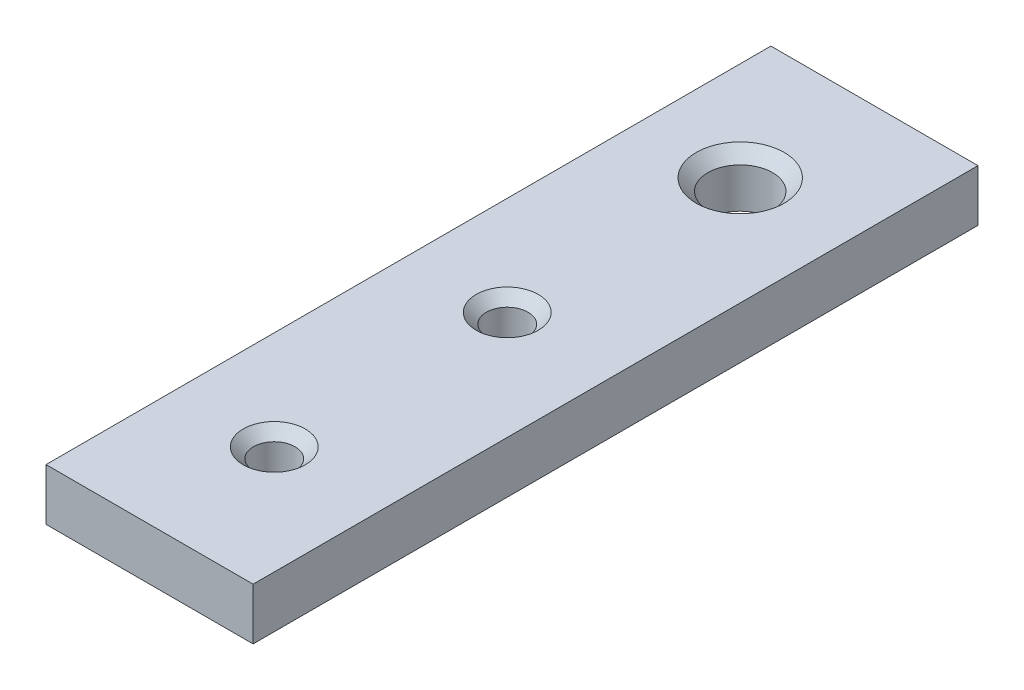
ISO-10303-21;
HEADER;
FILE_DESCRIPTION(('STEP AP214'),'2;1');
FILE_NAME('part.step','',(''),(''),'','','');
FILE_SCHEMA(('AUTOMOTIVE_DESIGN { 1 0 10303 214 1 1 1 1 }'));
ENDSEC;
DATA;
#1=APPLICATION_CONTEXT('core data for automotive mechanical design processes');
#2=APPLICATION_PROTOCOL_DEFINITION('international standard','automotive_design',2000,#1);
#3=PRODUCT_CONTEXT('',#1,'mechanical');
#4=PRODUCT('Part','Part','',(#3));
#5=PRODUCT_RELATED_PRODUCT_CATEGORY('part','',(#4));
#6=PRODUCT_DEFINITION_FORMATION('','',#4);
#7=PRODUCT_DEFINITION_CONTEXT('part definition',#1,'design');
#8=PRODUCT_DEFINITION('design','',#6,#7);
#9=PRODUCT_DEFINITION_SHAPE('','',#8);
#10=(LENGTH_UNIT() NAMED_UNIT(*) SI_UNIT(.MILLI.,.METRE.));
#11=(NAMED_UNIT(*) PLANE_ANGLE_UNIT() SI_UNIT($,.RADIAN.));
#12=(NAMED_UNIT(*) SI_UNIT($,.STERADIAN.) SOLID_ANGLE_UNIT());
#13=UNCERTAINTY_MEASURE_WITH_UNIT(LENGTH_MEASURE(1.E-05),#10,'distance_accuracy_value','');
#14=(GEOMETRIC_REPRESENTATION_CONTEXT(3) GLOBAL_UNCERTAINTY_ASSIGNED_CONTEXT((#13)) GLOBAL_UNIT_ASSIGNED_CONTEXT((#10,
#11,#12)) REPRESENTATION_CONTEXT('',''));
#15=CARTESIAN_POINT('',(0.,0.,0.));
#16=DIRECTION('',(0.,0.,1.));
#17=DIRECTION('',(1.,0.,0.));
#18=AXIS2_PLACEMENT_3D('',#15,#16,#17);
#19=CARTESIAN_POINT('',(0.,6.35,0.));
#20=DIRECTION('',(-1.,0.,0.));
#21=DIRECTION('',(0.,0.,1.));
#22=AXIS2_PLACEMENT_3D('',#19,#20,#21);
#23=PLANE('',#22);
#24=DIRECTION('',(0.,0.,-1.));
#25=VECTOR('',#24,1.);
#26=CARTESIAN_POINT('',(0.,0.,0.));
#27=LINE('',#26,#25);
#28=CARTESIAN_POINT('',(0.,0.,0.));
#29=VERTEX_POINT('',#28);
#30=CARTESIAN_POINT('',(0.,0.,-88.9));
#31=VERTEX_POINT('',#30);
#32=EDGE_CURVE('E101',#29,#31,#27,.T.);
#33=ORIENTED_EDGE('',*,*,#32,.T.);
#34=DIRECTION('',(0.,-1.,0.));
#35=VECTOR('',#34,1.);
#36=CARTESIAN_POINT('',(0.,6.35,-88.9));
#37=LINE('',#36,#35);
#38=CARTESIAN_POINT('',(0.,6.35,-88.9));
#39=VERTEX_POINT('',#38);
#40=EDGE_CURVE('E11',#39,#31,#37,.T.);
#41=ORIENTED_EDGE('',*,*,#40,.F.);
#42=DIRECTION('',(0.,0.,-1.));
#43=VECTOR('',#42,1.);
#44=CARTESIAN_POINT('',(0.,6.35,0.));
#45=LINE('',#44,#43);
#46=CARTESIAN_POINT('',(0.,6.35,0.));
#47=VERTEX_POINT('',#46);
#48=EDGE_CURVE('E89',#47,#39,#45,.T.);
#49=ORIENTED_EDGE('',*,*,#48,.F.);
#50=DIRECTION('',(0.,-1.,0.));
#51=VECTOR('',#50,1.);
#52=CARTESIAN_POINT('',(0.,6.35,0.));
#53=LINE('',#52,#51);
#54=EDGE_CURVE('E97',#47,#29,#53,.T.);
#55=ORIENTED_EDGE('',*,*,#54,.T.);
#56=EDGE_LOOP('',(#33,#41,#49,#55));
#57=FACE_BOUND('',#56,.T.);
#58=ADVANCED_FACE('F38',(#57),#23,.F.);
#59=CARTESIAN_POINT('',(0.,6.35,-88.9));
#60=DIRECTION('',(0.,0.,1.));
#61=DIRECTION('',(1.,0.,0.));
#62=AXIS2_PLACEMENT_3D('',#59,#60,#61);
#63=PLANE('',#62);
#64=DIRECTION('',(-1.,0.,0.));
#65=VECTOR('',#64,1.);
#66=CARTESIAN_POINT('',(0.,0.,-88.9));
#67=LINE('',#66,#65);
#68=CARTESIAN_POINT('',(-25.4,0.,-88.9));
#69=VERTEX_POINT('',#68);
#70=EDGE_CURVE('E93',#31,#69,#67,.T.);
#71=ORIENTED_EDGE('',*,*,#70,.T.);
#72=DIRECTION('',(0.,-1.,0.));
#73=VECTOR('',#72,1.);
#74=CARTESIAN_POINT('',(-25.4,6.35,-88.9));
#75=LINE('',#74,#73);
#76=CARTESIAN_POINT('',(-25.4,6.35,-88.9));
#77=VERTEX_POINT('',#76);
#78=EDGE_CURVE('E46',#77,#69,#75,.T.);
#79=ORIENTED_EDGE('',*,*,#78,.F.);
#80=DIRECTION('',(-1.,0.,0.));
#81=VECTOR('',#80,1.);
#82=CARTESIAN_POINT('',(0.,6.35,-88.9));
#83=LINE('',#82,#81);
#84=EDGE_CURVE('E84',#39,#77,#83,.T.);
#85=ORIENTED_EDGE('',*,*,#84,.F.);
#86=ORIENTED_EDGE('',*,*,#40,.T.);
#87=EDGE_LOOP('',(#71,#79,#85,#86));
#88=FACE_BOUND('',#87,.T.);
#89=ADVANCED_FACE('F92',(#88),#63,.F.);
#90=CARTESIAN_POINT('',(-25.4,6.35,0.));
#91=DIRECTION('',(1.,0.,0.));
#92=DIRECTION('',(0.,0.,-1.));
#93=AXIS2_PLACEMENT_3D('',#90,#91,#92);
#94=PLANE('',#93);
#95=DIRECTION('',(0.,0.,1.));
#96=VECTOR('',#95,1.);
#97=CARTESIAN_POINT('',(-25.4,0.,0.));
#98=LINE('',#97,#96);
#99=CARTESIAN_POINT('',(-25.4,0.,0.));
#100=VERTEX_POINT('',#99);
#101=EDGE_CURVE('E71',#69,#100,#98,.T.);
#102=ORIENTED_EDGE('',*,*,#101,.T.);
#103=DIRECTION('',(0.,-1.,0.));
#104=VECTOR('',#103,1.);
#105=CARTESIAN_POINT('',(-25.4,6.35,0.));
#106=LINE('',#105,#104);
#107=CARTESIAN_POINT('',(-25.4,6.35,0.));
#108=VERTEX_POINT('',#107);
#109=EDGE_CURVE('E94',#108,#100,#106,.T.);
#110=ORIENTED_EDGE('',*,*,#109,.F.);
#111=DIRECTION('',(0.,0.,1.));
#112=VECTOR('',#111,1.);
#113=CARTESIAN_POINT('',(-25.4,6.35,0.));
#114=LINE('',#113,#112);
#115=EDGE_CURVE('E87',#77,#108,#114,.T.);
#116=ORIENTED_EDGE('',*,*,#115,.F.);
#117=ORIENTED_EDGE('',*,*,#78,.T.);
#118=EDGE_LOOP('',(#102,#110,#116,#117));
#119=FACE_BOUND('',#118,.T.);
#120=ADVANCED_FACE('F95',(#119),#94,.F.);
#121=CARTESIAN_POINT('',(0.,6.35,0.));
#122=DIRECTION('',(0.,0.,-1.));
#123=DIRECTION('',(-1.,0.,0.));
#124=AXIS2_PLACEMENT_3D('',#121,#122,#123);
#125=PLANE('',#124);
#126=DIRECTION('',(1.,0.,0.));
#127=VECTOR('',#126,1.);
#128=CARTESIAN_POINT('',(0.,0.,0.));
#129=LINE('',#128,#127);
#130=EDGE_CURVE('E77',#100,#29,#129,.T.);
#131=ORIENTED_EDGE('',*,*,#130,.T.);
#132=ORIENTED_EDGE('',*,*,#54,.F.);
#133=DIRECTION('',(1.,0.,0.));
#134=VECTOR('',#133,1.);
#135=CARTESIAN_POINT('',(0.,6.35,0.));
#136=LINE('',#135,#134);
#137=EDGE_CURVE('E54',#108,#47,#136,.T.);
#138=ORIENTED_EDGE('',*,*,#137,.F.);
#139=ORIENTED_EDGE('',*,*,#109,.T.);
#140=EDGE_LOOP('',(#131,#132,#138,#139));
#141=FACE_BOUND('',#140,.T.);
#142=ADVANCED_FACE('F109',(#141),#125,.F.);
#143=CARTESIAN_POINT('',(0.,6.35,0.));
#144=DIRECTION('',(0.,1.,0.));
#145=DIRECTION('',(0.,0.,1.));
#146=AXIS2_PLACEMENT_3D('',#143,#144,#145);
#147=PLANE('',#146);
#148=CARTESIAN_POINT('',(-13.2844190722783,6.35,-73.025));
#149=DIRECTION('',(0.,1.,0.));
#150=DIRECTION('',(0.,0.,1.));
#151=AXIS2_PLACEMENT_3D('',#148,#149,#150);
#152=CIRCLE('',#151,5.3975);
#153=CARTESIAN_POINT('',(-13.2844190722783,6.35,-67.6275));
#154=VERTEX_POINT('',#153);
#155=EDGE_CURVE('E138',#154,#154,#152,.T.);
#156=ORIENTED_EDGE('',*,*,#155,.F.);
#157=EDGE_LOOP('',(#156));
#158=FACE_BOUND('',#157,.T.);
#159=CARTESIAN_POINT('',(-13.2844190722783,6.35,-15.875));
#160=DIRECTION('',(0.,1.,0.));
#161=DIRECTION('',(0.,0.,1.));
#162=AXIS2_PLACEMENT_3D('',#159,#160,#161);
#163=CIRCLE('',#162,3.81);
#164=CARTESIAN_POINT('',(-13.2844190722783,6.35,-12.065));
#165=VERTEX_POINT('',#164);
#166=EDGE_CURVE('E129',#165,#165,#163,.T.);
#167=ORIENTED_EDGE('',*,*,#166,.F.);
#168=EDGE_LOOP('',(#167));
#169=FACE_BOUND('',#168,.T.);
#170=CARTESIAN_POINT('',(-13.2844190722783,6.35,-44.45));
#171=DIRECTION('',(0.,1.,0.));
#172=DIRECTION('',(0.,0.,1.));
#173=AXIS2_PLACEMENT_3D('',#170,#171,#172);
#174=CIRCLE('',#173,3.81);
#175=CARTESIAN_POINT('',(-13.2844190722783,6.35,-40.64));
#176=VERTEX_POINT('',#175);
#177=EDGE_CURVE('E120',#176,#176,#174,.T.);
#178=ORIENTED_EDGE('',*,*,#177,.F.);
#179=EDGE_LOOP('',(#178));
#180=FACE_BOUND('',#179,.T.);
#181=ORIENTED_EDGE('',*,*,#48,.T.);
#182=ORIENTED_EDGE('',*,*,#84,.T.);
#183=ORIENTED_EDGE('',*,*,#115,.T.);
#184=ORIENTED_EDGE('',*,*,#137,.T.);
#185=EDGE_LOOP('',(#181,#182,#183,#184));
#186=FACE_BOUND('',#185,.T.);
#187=ADVANCED_FACE('F85',(#158,#169,#180,#186),#147,.T.);
#188=CARTESIAN_POINT('',(0.,0.,0.));
#189=DIRECTION('',(0.,1.,0.));
#190=DIRECTION('',(0.,0.,1.));
#191=AXIS2_PLACEMENT_3D('',#188,#189,#190);
#192=PLANE('',#191);
#193=CARTESIAN_POINT('',(-13.2844190722783,0.,-73.025));
#194=DIRECTION('',(0.,1.,0.));
#195=DIRECTION('',(0.,0.,1.));
#196=AXIS2_PLACEMENT_3D('',#193,#194,#195);
#197=CIRCLE('',#196,3.96875);
#198=CARTESIAN_POINT('',(-13.2844190722783,0.,-69.05625));
#199=VERTEX_POINT('',#198);
#200=EDGE_CURVE('E132',#199,#199,#197,.T.);
#201=ORIENTED_EDGE('',*,*,#200,.T.);
#202=EDGE_LOOP('',(#201));
#203=FACE_BOUND('',#202,.T.);
#204=CARTESIAN_POINT('',(-13.2844190722783,0.,-15.875));
#205=DIRECTION('',(0.,1.,0.));
#206=DIRECTION('',(0.,0.,1.));
#207=AXIS2_PLACEMENT_3D('',#204,#205,#206);
#208=CIRCLE('',#207,2.5527);
#209=CARTESIAN_POINT('',(-13.2844190722783,0.,-13.3223));
#210=VERTEX_POINT('',#209);
#211=EDGE_CURVE('E123',#210,#210,#208,.T.);
#212=ORIENTED_EDGE('',*,*,#211,.T.);
#213=EDGE_LOOP('',(#212));
#214=FACE_BOUND('',#213,.T.);
#215=CARTESIAN_POINT('',(-13.2844190722783,0.,-44.45));
#216=DIRECTION('',(0.,1.,0.));
#217=DIRECTION('',(0.,0.,1.));
#218=AXIS2_PLACEMENT_3D('',#215,#216,#217);
#219=CIRCLE('',#218,2.5527);
#220=CARTESIAN_POINT('',(-13.2844190722783,0.,-41.8973));
#221=VERTEX_POINT('',#220);
#222=EDGE_CURVE('E104',#221,#221,#219,.T.);
#223=ORIENTED_EDGE('',*,*,#222,.T.);
#224=EDGE_LOOP('',(#223));
#225=FACE_BOUND('',#224,.T.);
#226=ORIENTED_EDGE('',*,*,#32,.F.);
#227=ORIENTED_EDGE('',*,*,#130,.F.);
#228=ORIENTED_EDGE('',*,*,#101,.F.);
#229=ORIENTED_EDGE('',*,*,#70,.F.);
#230=EDGE_LOOP('',(#226,#227,#228,#229));
#231=FACE_BOUND('',#230,.T.);
#232=ADVANCED_FACE('F112',(#203,#214,#225,#231),#192,.F.);
#233=CARTESIAN_POINT('',(-13.2844190722783,6.35,-44.45));
#234=DIRECTION('',(0.,1.,0.));
#235=DIRECTION('',(0.,0.,1.));
#236=AXIS2_PLACEMENT_3D('',#233,#234,#235);
#237=CYLINDRICAL_SURFACE('',#236,2.55269999999999);
#238=ORIENTED_EDGE('',*,*,#222,.F.);
#239=EDGE_LOOP('',(#238));
#240=FACE_BOUND('',#239,.T.);
#241=CARTESIAN_POINT('',(-13.2844190722783,5.0927,-44.45));
#242=DIRECTION('',(0.,1.,0.));
#243=DIRECTION('',(0.,0.,1.));
#244=AXIS2_PLACEMENT_3D('',#241,#242,#243);
#245=CIRCLE('',#244,2.55269999999999);
#246=CARTESIAN_POINT('',(-13.2844190722783,5.0927,-41.8973));
#247=VERTEX_POINT('',#246);
#248=EDGE_CURVE('E117',#247,#247,#245,.T.);
#249=ORIENTED_EDGE('',*,*,#248,.T.);
#250=EDGE_LOOP('',(#249));
#251=FACE_BOUND('',#250,.T.);
#252=ADVANCED_FACE('F154',(#240,#251),#237,.F.);
#253=CARTESIAN_POINT('',(-13.2844190722783,6.35,-44.45));
#254=DIRECTION('',(0.,1.,0.));
#255=DIRECTION('',(0.,0.,1.));
#256=AXIS2_PLACEMENT_3D('',#253,#254,#255);
#257=CONICAL_SURFACE('',#256,3.81,0.785398163397451);
#258=ORIENTED_EDGE('',*,*,#248,.F.);
#259=EDGE_LOOP('',(#258));
#260=FACE_BOUND('',#259,.T.);
#261=ORIENTED_EDGE('',*,*,#177,.T.);
#262=EDGE_LOOP('',(#261));
#263=FACE_BOUND('',#262,.T.);
#264=ADVANCED_FACE('F151',(#260,#263),#257,.F.);
#265=CARTESIAN_POINT('',(-13.2844190722783,6.35,-15.875));
#266=DIRECTION('',(0.,1.,0.));
#267=DIRECTION('',(0.,0.,1.));
#268=AXIS2_PLACEMENT_3D('',#265,#266,#267);
#269=CYLINDRICAL_SURFACE('',#268,2.55269999999999);
#270=ORIENTED_EDGE('',*,*,#211,.F.);
#271=EDGE_LOOP('',(#270));
#272=FACE_BOUND('',#271,.T.);
#273=CARTESIAN_POINT('',(-13.2844190722783,5.0927,-15.875));
#274=DIRECTION('',(0.,1.,0.));
#275=DIRECTION('',(0.,0.,1.));
#276=AXIS2_PLACEMENT_3D('',#273,#274,#275);
#277=CIRCLE('',#276,2.55269999999999);
#278=CARTESIAN_POINT('',(-13.2844190722783,5.0927,-13.3223));
#279=VERTEX_POINT('',#278);
#280=EDGE_CURVE('E126',#279,#279,#277,.T.);
#281=ORIENTED_EDGE('',*,*,#280,.T.);
#282=EDGE_LOOP('',(#281));
#283=FACE_BOUND('',#282,.T.);
#284=ADVANCED_FACE('F153',(#272,#283),#269,.F.);
#285=CARTESIAN_POINT('',(-13.2844190722783,6.35,-15.875));
#286=DIRECTION('',(0.,1.,0.));
#287=DIRECTION('',(0.,0.,1.));
#288=AXIS2_PLACEMENT_3D('',#285,#286,#287);
#289=CONICAL_SURFACE('',#288,3.81,0.785398163397451);
#290=ORIENTED_EDGE('',*,*,#280,.F.);
#291=EDGE_LOOP('',(#290));
#292=FACE_BOUND('',#291,.T.);
#293=ORIENTED_EDGE('',*,*,#166,.T.);
#294=EDGE_LOOP('',(#293));
#295=FACE_BOUND('',#294,.T.);
#296=ADVANCED_FACE('F161',(#292,#295),#289,.F.);
#297=CARTESIAN_POINT('',(-13.2844190722783,6.35,-73.025));
#298=DIRECTION('',(0.,1.,0.));
#299=DIRECTION('',(0.,0.,1.));
#300=AXIS2_PLACEMENT_3D('',#297,#298,#299);
#301=CYLINDRICAL_SURFACE('',#300,3.96875);
#302=ORIENTED_EDGE('',*,*,#200,.F.);
#303=EDGE_LOOP('',(#302));
#304=FACE_BOUND('',#303,.T.);
#305=CARTESIAN_POINT('',(-13.2844190722783,4.92125,-73.025));
#306=DIRECTION('',(0.,1.,0.));
#307=DIRECTION('',(0.,0.,1.));
#308=AXIS2_PLACEMENT_3D('',#305,#306,#307);
#309=CIRCLE('',#308,3.96875);
#310=CARTESIAN_POINT('',(-13.2844190722783,4.92125,-69.05625));
#311=VERTEX_POINT('',#310);
#312=EDGE_CURVE('E135',#311,#311,#309,.T.);
#313=ORIENTED_EDGE('',*,*,#312,.T.);
#314=EDGE_LOOP('',(#313));
#315=FACE_BOUND('',#314,.T.);
#316=ADVANCED_FACE('F193',(#304,#315),#301,.F.);
#317=CARTESIAN_POINT('',(-13.2844190722783,6.35,-73.025));
#318=DIRECTION('',(0.,1.,0.));
#319=DIRECTION('',(0.,0.,1.));
#320=AXIS2_PLACEMENT_3D('',#317,#318,#319);
#321=CONICAL_SURFACE('',#320,5.3975,0.78539816339745);
#322=ORIENTED_EDGE('',*,*,#312,.F.);
#323=EDGE_LOOP('',(#322));
#324=FACE_BOUND('',#323,.T.);
#325=ORIENTED_EDGE('',*,*,#155,.T.);
#326=EDGE_LOOP('',(#325));
#327=FACE_BOUND('',#326,.T.);
#328=ADVANCED_FACE('F142',(#324,#327),#321,.F.);
#329=CLOSED_SHELL('',(#58,#89,#120,#142,#187,#232,#252,#264,#284,#296,#316,#328));
#330=MANIFOLD_SOLID_BREP('B2',#329);
#331=ADVANCED_BREP_SHAPE_REPRESENTATION('',(#18,#330),#14);
#332=SHAPE_DEFINITION_REPRESENTATION(#9,#331);
ENDSEC;
END-ISO-10303-21;
